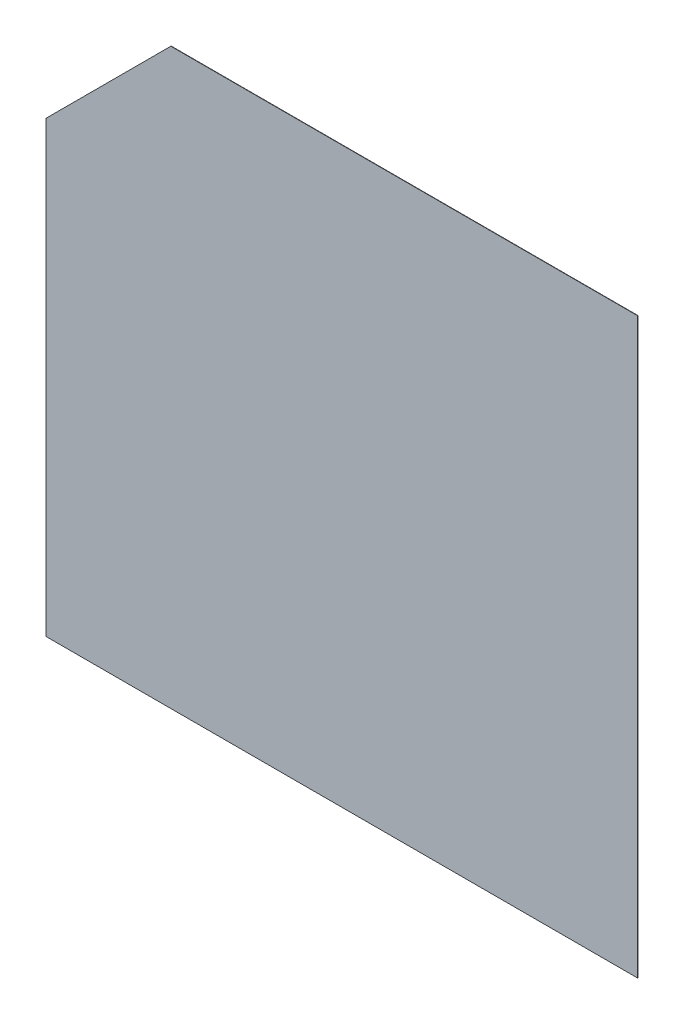
ISO-10303-21;
HEADER;
FILE_DESCRIPTION(('STEP AP214'),'2;1');
FILE_NAME('part.step','',(''),(''),'','','');
FILE_SCHEMA(('AUTOMOTIVE_DESIGN { 1 0 10303 214 1 1 1 1 }'));
ENDSEC;
DATA;
#1=APPLICATION_CONTEXT('core data for automotive mechanical design processes');
#2=APPLICATION_PROTOCOL_DEFINITION('international standard','automotive_design',2000,#1);
#3=PRODUCT_CONTEXT('',#1,'mechanical');
#4=PRODUCT('Part','Part','',(#3));
#5=PRODUCT_RELATED_PRODUCT_CATEGORY('part','',(#4));
#6=PRODUCT_DEFINITION_FORMATION('','',#4);
#7=PRODUCT_DEFINITION_CONTEXT('part definition',#1,'design');
#8=PRODUCT_DEFINITION('design','',#6,#7);
#9=PRODUCT_DEFINITION_SHAPE('','',#8);
#10=(LENGTH_UNIT() NAMED_UNIT(*) SI_UNIT(.MILLI.,.METRE.));
#11=(NAMED_UNIT(*) PLANE_ANGLE_UNIT() SI_UNIT($,.RADIAN.));
#12=(NAMED_UNIT(*) SI_UNIT($,.STERADIAN.) SOLID_ANGLE_UNIT());
#13=UNCERTAINTY_MEASURE_WITH_UNIT(LENGTH_MEASURE(1.E-05),#10,'distance_accuracy_value','');
#14=(GEOMETRIC_REPRESENTATION_CONTEXT(3) GLOBAL_UNCERTAINTY_ASSIGNED_CONTEXT((#13)) GLOBAL_UNIT_ASSIGNED_CONTEXT((#10,
#11,#12)) REPRESENTATION_CONTEXT('',''));
#15=CARTESIAN_POINT('',(0.,0.,0.));
#16=DIRECTION('',(0.,0.,1.));
#17=DIRECTION('',(1.,0.,0.));
#18=AXIS2_PLACEMENT_3D('',#15,#16,#17);
#19=CARTESIAN_POINT('',(0.,0.,0.001));
#20=DIRECTION('',(0.,0.,-1.));
#21=DIRECTION('',(-1.,0.,0.));
#22=AXIS2_PLACEMENT_3D('',#19,#20,#21);
#23=PLANE('',#22);
#24=DIRECTION('',(0.,1.,0.));
#25=VECTOR('',#24,1.);
#26=CARTESIAN_POINT('',(1.66,0.,0.001));
#27=LINE('',#26,#25);
#28=CARTESIAN_POINT('',(1.66,0.,0.001));
#29=VERTEX_POINT('',#28);
#30=CARTESIAN_POINT('',(1.66,1.61,0.001));
#31=VERTEX_POINT('',#30);
#32=EDGE_CURVE('E85',#29,#31,#27,.T.);
#33=ORIENTED_EDGE('',*,*,#32,.T.);
#34=DIRECTION('',(1.,0.,0.));
#35=VECTOR('',#34,1.);
#36=CARTESIAN_POINT('',(1.66,1.61,0.001));
#37=LINE('',#36,#35);
#38=CARTESIAN_POINT('',(0.35,1.61,0.001));
#39=VERTEX_POINT('',#38);
#40=EDGE_CURVE('E66',#31,#39,#37,.F.);
#41=ORIENTED_EDGE('',*,*,#40,.T.);
#42=DIRECTION('',(0.707106781186548,0.707106781186548,0.));
#43=VECTOR('',#42,1.);
#44=CARTESIAN_POINT('',(0.35,1.61,0.001));
#45=LINE('',#44,#43);
#46=CARTESIAN_POINT('',(0.,1.26,0.001));
#47=VERTEX_POINT('',#46);
#48=EDGE_CURVE('E60',#39,#47,#45,.F.);
#49=ORIENTED_EDGE('',*,*,#48,.T.);
#50=DIRECTION('',(0.,1.,0.));
#51=VECTOR('',#50,1.);
#52=CARTESIAN_POINT('',(0.,1.26,0.001));
#53=LINE('',#52,#51);
#54=CARTESIAN_POINT('',(0.,0.,0.001));
#55=VERTEX_POINT('',#54);
#56=EDGE_CURVE('E63',#47,#55,#53,.F.);
#57=ORIENTED_EDGE('',*,*,#56,.T.);
#58=DIRECTION('',(1.,0.,0.));
#59=VECTOR('',#58,1.);
#60=CARTESIAN_POINT('',(0.,0.,0.001));
#61=LINE('',#60,#59);
#62=EDGE_CURVE('E93',#55,#29,#61,.T.);
#63=ORIENTED_EDGE('',*,*,#62,.T.);
#64=EDGE_LOOP('',(#33,#41,#49,#57,#63));
#65=FACE_BOUND('',#64,.T.);
#66=ADVANCED_FACE('F17',(#65),#23,.F.);
#67=CARTESIAN_POINT('',(0.,1.26,0.));
#68=DIRECTION('',(1.,0.,0.));
#69=DIRECTION('',(0.,0.,-1.));
#70=AXIS2_PLACEMENT_3D('',#67,#68,#69);
#71=PLANE('',#70);
#72=DIRECTION('',(0.,0.,-1.));
#73=VECTOR('',#72,1.);
#74=CARTESIAN_POINT('',(0.,0.,0.));
#75=LINE('',#74,#73);
#76=CARTESIAN_POINT('',(0.,0.,0.));
#77=VERTEX_POINT('',#76);
#78=EDGE_CURVE('E76',#77,#55,#75,.F.);
#79=ORIENTED_EDGE('',*,*,#78,.T.);
#80=ORIENTED_EDGE('',*,*,#56,.F.);
#81=DIRECTION('',(0.,0.,-1.));
#82=VECTOR('',#81,1.);
#83=CARTESIAN_POINT('',(0.,1.26,0.));
#84=LINE('',#83,#82);
#85=CARTESIAN_POINT('',(0.,1.26,0.));
#86=VERTEX_POINT('',#85);
#87=EDGE_CURVE('E20',#47,#86,#84,.T.);
#88=ORIENTED_EDGE('',*,*,#87,.T.);
#89=DIRECTION('',(0.,1.,0.));
#90=VECTOR('',#89,1.);
#91=CARTESIAN_POINT('',(0.,0.,0.));
#92=LINE('',#91,#90);
#93=EDGE_CURVE('E90',#77,#86,#92,.T.);
#94=ORIENTED_EDGE('',*,*,#93,.F.);
#95=EDGE_LOOP('',(#79,#80,#88,#94));
#96=FACE_BOUND('',#95,.T.);
#97=ADVANCED_FACE('F73',(#96),#71,.F.);
#98=CARTESIAN_POINT('',(0.35,1.61,0.));
#99=DIRECTION('',(0.707106781186548,-0.707106781186548,0.));
#100=DIRECTION('',(0.707106781186548,0.707106781186548,0.));
#101=AXIS2_PLACEMENT_3D('',#98,#99,#100);
#102=PLANE('',#101);
#103=ORIENTED_EDGE('',*,*,#87,.F.);
#104=ORIENTED_EDGE('',*,*,#48,.F.);
#105=DIRECTION('',(0.,0.,1.));
#106=VECTOR('',#105,1.);
#107=CARTESIAN_POINT('',(0.35,1.61,0.));
#108=LINE('',#107,#106);
#109=CARTESIAN_POINT('',(0.35,1.61,0.));
#110=VERTEX_POINT('',#109);
#111=EDGE_CURVE('E83',#39,#110,#108,.F.);
#112=ORIENTED_EDGE('',*,*,#111,.T.);
#113=DIRECTION('',(0.707106781186547,0.707106781186548,0.));
#114=VECTOR('',#113,1.);
#115=CARTESIAN_POINT('',(0.,1.26,0.));
#116=LINE('',#115,#114);
#117=EDGE_CURVE('E81',#86,#110,#116,.T.);
#118=ORIENTED_EDGE('',*,*,#117,.F.);
#119=EDGE_LOOP('',(#103,#104,#112,#118));
#120=FACE_BOUND('',#119,.T.);
#121=ADVANCED_FACE('F79',(#120),#102,.F.);
#122=CARTESIAN_POINT('',(1.66,1.61,0.));
#123=DIRECTION('',(0.,-1.,0.));
#124=DIRECTION('',(0.,0.,-1.));
#125=AXIS2_PLACEMENT_3D('',#122,#123,#124);
#126=PLANE('',#125);
#127=ORIENTED_EDGE('',*,*,#111,.F.);
#128=ORIENTED_EDGE('',*,*,#40,.F.);
#129=DIRECTION('',(0.,0.,-1.));
#130=VECTOR('',#129,1.);
#131=CARTESIAN_POINT('',(1.66,1.61,0.));
#132=LINE('',#131,#130);
#133=CARTESIAN_POINT('',(1.66,1.61,0.));
#134=VERTEX_POINT('',#133);
#135=EDGE_CURVE('E95',#31,#134,#132,.T.);
#136=ORIENTED_EDGE('',*,*,#135,.T.);
#137=DIRECTION('',(-1.,0.,0.));
#138=VECTOR('',#137,1.);
#139=CARTESIAN_POINT('',(0.,1.61,0.));
#140=LINE('',#139,#138);
#141=EDGE_CURVE('E88',#110,#134,#140,.F.);
#142=ORIENTED_EDGE('',*,*,#141,.F.);
#143=EDGE_LOOP('',(#127,#128,#136,#142));
#144=FACE_BOUND('',#143,.T.);
#145=ADVANCED_FACE('F109',(#144),#126,.F.);
#146=CARTESIAN_POINT('',(1.66,0.,0.));
#147=DIRECTION('',(-1.,0.,0.));
#148=DIRECTION('',(0.,0.,1.));
#149=AXIS2_PLACEMENT_3D('',#146,#147,#148);
#150=PLANE('',#149);
#151=ORIENTED_EDGE('',*,*,#135,.F.);
#152=ORIENTED_EDGE('',*,*,#32,.F.);
#153=DIRECTION('',(0.,0.,1.));
#154=VECTOR('',#153,1.);
#155=CARTESIAN_POINT('',(1.66,0.,0.));
#156=LINE('',#155,#154);
#157=CARTESIAN_POINT('',(1.66,0.,0.));
#158=VERTEX_POINT('',#157);
#159=EDGE_CURVE('E35',#29,#158,#156,.F.);
#160=ORIENTED_EDGE('',*,*,#159,.T.);
#161=DIRECTION('',(0.,1.,0.));
#162=VECTOR('',#161,1.);
#163=CARTESIAN_POINT('',(1.66,0.,0.));
#164=LINE('',#163,#162);
#165=EDGE_CURVE('E26',#134,#158,#164,.F.);
#166=ORIENTED_EDGE('',*,*,#165,.F.);
#167=EDGE_LOOP('',(#151,#152,#160,#166));
#168=FACE_BOUND('',#167,.T.);
#169=ADVANCED_FACE('F104',(#168),#150,.F.);
#170=CARTESIAN_POINT('',(0.,0.,0.));
#171=DIRECTION('',(0.,1.,0.));
#172=DIRECTION('',(0.,0.,1.));
#173=AXIS2_PLACEMENT_3D('',#170,#171,#172);
#174=PLANE('',#173);
#175=ORIENTED_EDGE('',*,*,#159,.F.);
#176=ORIENTED_EDGE('',*,*,#62,.F.);
#177=ORIENTED_EDGE('',*,*,#78,.F.);
#178=DIRECTION('',(-1.,0.,0.));
#179=VECTOR('',#178,1.);
#180=CARTESIAN_POINT('',(0.,0.,0.));
#181=LINE('',#180,#179);
#182=EDGE_CURVE('E11',#158,#77,#181,.T.);
#183=ORIENTED_EDGE('',*,*,#182,.F.);
#184=EDGE_LOOP('',(#175,#176,#177,#183));
#185=FACE_BOUND('',#184,.T.);
#186=ADVANCED_FACE('F105',(#185),#174,.F.);
#187=CARTESIAN_POINT('',(0.,0.,0.));
#188=DIRECTION('',(0.,0.,-1.));
#189=DIRECTION('',(-1.,0.,0.));
#190=AXIS2_PLACEMENT_3D('',#187,#188,#189);
#191=PLANE('',#190);
#192=ORIENTED_EDGE('',*,*,#165,.T.);
#193=ORIENTED_EDGE('',*,*,#182,.T.);
#194=ORIENTED_EDGE('',*,*,#93,.T.);
#195=ORIENTED_EDGE('',*,*,#117,.T.);
#196=ORIENTED_EDGE('',*,*,#141,.T.);
#197=EDGE_LOOP('',(#192,#193,#194,#195,#196));
#198=FACE_BOUND('',#197,.T.);
#199=ADVANCED_FACE('F108',(#198),#191,.T.);
#200=CLOSED_SHELL('',(#66,#97,#121,#145,#169,#186,#199));
#201=MANIFOLD_SOLID_BREP('B1',#200);
#202=ADVANCED_BREP_SHAPE_REPRESENTATION('',(#18,#201),#14);
#203=SHAPE_DEFINITION_REPRESENTATION(#9,#202);
ENDSEC;
END-ISO-10303-21;
